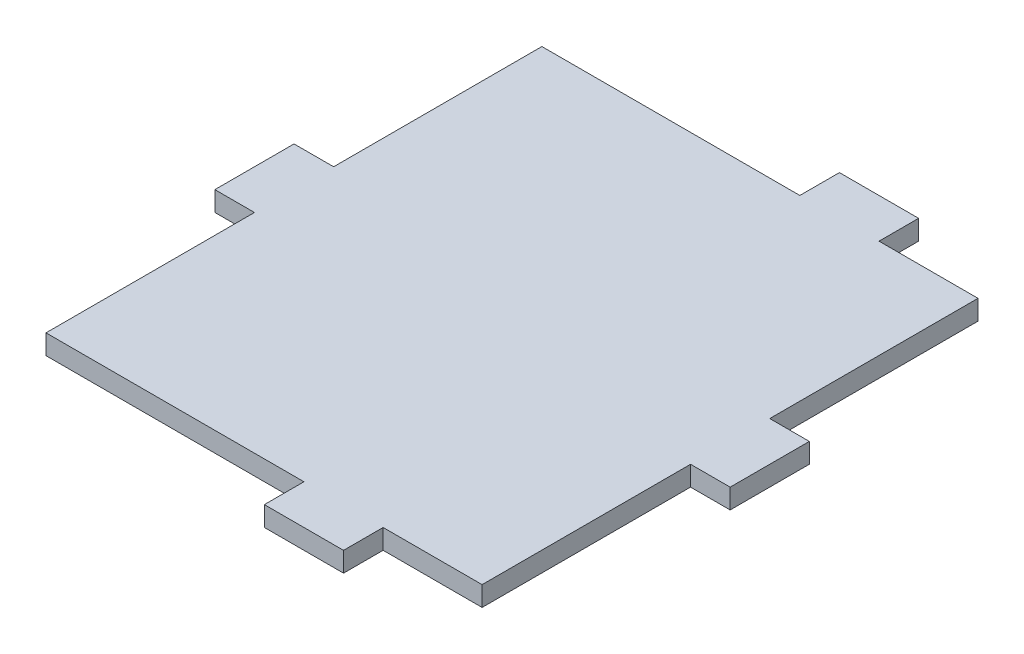
ISO-10303-21;
HEADER;
FILE_DESCRIPTION(('STEP AP214'),'2;1');
FILE_NAME('part.step','',(''),(''),'','','');
FILE_SCHEMA(('AUTOMOTIVE_DESIGN { 1 0 10303 214 1 1 1 1 }'));
ENDSEC;
DATA;
#1=APPLICATION_CONTEXT('core data for automotive mechanical design processes');
#2=APPLICATION_PROTOCOL_DEFINITION('international standard','automotive_design',2000,#1);
#3=PRODUCT_CONTEXT('',#1,'mechanical');
#4=PRODUCT('Part','Part','',(#3));
#5=PRODUCT_RELATED_PRODUCT_CATEGORY('part','',(#4));
#6=PRODUCT_DEFINITION_FORMATION('','',#4);
#7=PRODUCT_DEFINITION_CONTEXT('part definition',#1,'design');
#8=PRODUCT_DEFINITION('design','',#6,#7);
#9=PRODUCT_DEFINITION_SHAPE('','',#8);
#10=(LENGTH_UNIT() NAMED_UNIT(*) SI_UNIT(.MILLI.,.METRE.));
#11=(NAMED_UNIT(*) PLANE_ANGLE_UNIT() SI_UNIT($,.RADIAN.));
#12=(NAMED_UNIT(*) SI_UNIT($,.STERADIAN.) SOLID_ANGLE_UNIT());
#13=UNCERTAINTY_MEASURE_WITH_UNIT(LENGTH_MEASURE(1.E-05),#10,'distance_accuracy_value','');
#14=(GEOMETRIC_REPRESENTATION_CONTEXT(3) GLOBAL_UNCERTAINTY_ASSIGNED_CONTEXT((#13)) GLOBAL_UNIT_ASSIGNED_CONTEXT((#10,
#11,#12)) REPRESENTATION_CONTEXT('',''));
#15=CARTESIAN_POINT('',(0.,0.,0.));
#16=DIRECTION('',(0.,0.,1.));
#17=DIRECTION('',(1.,0.,0.));
#18=AXIS2_PLACEMENT_3D('',#15,#16,#17);
#19=CARTESIAN_POINT('',(15.03,1.,-29.05));
#20=DIRECTION('',(0.,0.,1.));
#21=DIRECTION('',(1.,0.,0.));
#22=AXIS2_PLACEMENT_3D('',#19,#20,#21);
#23=PLANE('',#22);
#24=DIRECTION('',(-1.,0.,0.));
#25=VECTOR('',#24,1.);
#26=CARTESIAN_POINT('',(15.03,0.,-29.05));
#27=LINE('',#26,#25);
#28=CARTESIAN_POINT('',(19.03,0.,-29.05));
#29=VERTEX_POINT('',#28);
#30=CARTESIAN_POINT('',(15.03,0.,-29.05));
#31=VERTEX_POINT('',#30);
#32=EDGE_CURVE('E212',#29,#31,#27,.T.);
#33=ORIENTED_EDGE('',*,*,#32,.T.);
#34=DIRECTION('',(0.,-1.,0.));
#35=VECTOR('',#34,1.);
#36=CARTESIAN_POINT('',(15.03,1.,-29.05));
#37=LINE('',#36,#35);
#38=CARTESIAN_POINT('',(15.03,1.,-29.05));
#39=VERTEX_POINT('',#38);
#40=EDGE_CURVE('E11',#39,#31,#37,.T.);
#41=ORIENTED_EDGE('',*,*,#40,.F.);
#42=DIRECTION('',(-1.,0.,0.));
#43=VECTOR('',#42,1.);
#44=CARTESIAN_POINT('',(15.03,1.,-29.05));
#45=LINE('',#44,#43);
#46=CARTESIAN_POINT('',(19.03,1.,-29.05));
#47=VERTEX_POINT('',#46);
#48=EDGE_CURVE('E270',#47,#39,#45,.T.);
#49=ORIENTED_EDGE('',*,*,#48,.F.);
#50=DIRECTION('',(0.,-1.,0.));
#51=VECTOR('',#50,1.);
#52=CARTESIAN_POINT('',(19.03,1.,-29.05));
#53=LINE('',#52,#51);
#54=EDGE_CURVE('E208',#47,#29,#53,.T.);
#55=ORIENTED_EDGE('',*,*,#54,.T.);
#56=EDGE_LOOP('',(#33,#41,#49,#55));
#57=FACE_BOUND('',#56,.T.);
#58=ADVANCED_FACE('F39',(#57),#23,.F.);
#59=CARTESIAN_POINT('',(15.03,1.,-27.05));
#60=DIRECTION('',(1.,0.,0.));
#61=DIRECTION('',(0.,0.,-1.));
#62=AXIS2_PLACEMENT_3D('',#59,#60,#61);
#63=PLANE('',#62);
#64=DIRECTION('',(0.,0.,1.));
#65=VECTOR('',#64,1.);
#66=CARTESIAN_POINT('',(15.03,0.,-27.05));
#67=LINE('',#66,#65);
#68=CARTESIAN_POINT('',(15.03,0.,-27.05));
#69=VERTEX_POINT('',#68);
#70=EDGE_CURVE('E216',#31,#69,#67,.T.);
#71=ORIENTED_EDGE('',*,*,#70,.T.);
#72=DIRECTION('',(0.,-1.,0.));
#73=VECTOR('',#72,1.);
#74=CARTESIAN_POINT('',(15.03,1.,-27.05));
#75=LINE('',#74,#73);
#76=CARTESIAN_POINT('',(15.03,1.,-27.05));
#77=VERTEX_POINT('',#76);
#78=EDGE_CURVE('E48',#77,#69,#75,.T.);
#79=ORIENTED_EDGE('',*,*,#78,.F.);
#80=DIRECTION('',(0.,0.,1.));
#81=VECTOR('',#80,1.);
#82=CARTESIAN_POINT('',(15.03,1.,-27.05));
#83=LINE('',#82,#81);
#84=EDGE_CURVE('E135',#39,#77,#83,.T.);
#85=ORIENTED_EDGE('',*,*,#84,.F.);
#86=ORIENTED_EDGE('',*,*,#40,.T.);
#87=EDGE_LOOP('',(#71,#79,#85,#86));
#88=FACE_BOUND('',#87,.T.);
#89=ADVANCED_FACE('F420',(#88),#63,.F.);
#90=CARTESIAN_POINT('',(15.03,1.,-27.05));
#91=DIRECTION('',(0.,0.,1.));
#92=DIRECTION('',(1.,0.,0.));
#93=AXIS2_PLACEMENT_3D('',#90,#91,#92);
#94=PLANE('',#93);
#95=DIRECTION('',(-1.,0.,0.));
#96=VECTOR('',#95,1.);
#97=CARTESIAN_POINT('',(15.03,0.,-27.05));
#98=LINE('',#97,#96);
#99=CARTESIAN_POINT('',(2.,0.,-27.05));
#100=VERTEX_POINT('',#99);
#101=EDGE_CURVE('E219',#69,#100,#98,.T.);
#102=ORIENTED_EDGE('',*,*,#101,.T.);
#103=DIRECTION('',(0.,-1.,0.));
#104=VECTOR('',#103,1.);
#105=CARTESIAN_POINT('',(2.,1.,-27.05));
#106=LINE('',#105,#104);
#107=CARTESIAN_POINT('',(2.,1.,-27.05));
#108=VERTEX_POINT('',#107);
#109=EDGE_CURVE('E329',#108,#100,#106,.T.);
#110=ORIENTED_EDGE('',*,*,#109,.F.);
#111=DIRECTION('',(-1.,0.,0.));
#112=VECTOR('',#111,1.);
#113=CARTESIAN_POINT('',(15.03,1.,-27.05));
#114=LINE('',#113,#112);
#115=EDGE_CURVE('E339',#77,#108,#114,.T.);
#116=ORIENTED_EDGE('',*,*,#115,.F.);
#117=ORIENTED_EDGE('',*,*,#78,.T.);
#118=EDGE_LOOP('',(#102,#110,#116,#117));
#119=FACE_BOUND('',#118,.T.);
#120=ADVANCED_FACE('F337',(#119),#94,.F.);
#121=CARTESIAN_POINT('',(2.,1.,-16.53));
#122=DIRECTION('',(1.,0.,0.));
#123=DIRECTION('',(0.,0.,-1.));
#124=AXIS2_PLACEMENT_3D('',#121,#122,#123);
#125=PLANE('',#124);
#126=DIRECTION('',(0.,0.,1.));
#127=VECTOR('',#126,1.);
#128=CARTESIAN_POINT('',(2.,0.,-16.53));
#129=LINE('',#128,#127);
#130=CARTESIAN_POINT('',(2.,0.,-16.53));
#131=VERTEX_POINT('',#130);
#132=EDGE_CURVE('E222',#100,#131,#129,.T.);
#133=ORIENTED_EDGE('',*,*,#132,.T.);
#134=DIRECTION('',(0.,-1.,0.));
#135=VECTOR('',#134,1.);
#136=CARTESIAN_POINT('',(2.,1.,-16.53));
#137=LINE('',#136,#135);
#138=CARTESIAN_POINT('',(2.,1.,-16.53));
#139=VERTEX_POINT('',#138);
#140=EDGE_CURVE('E325',#139,#131,#137,.T.);
#141=ORIENTED_EDGE('',*,*,#140,.F.);
#142=DIRECTION('',(0.,0.,1.));
#143=VECTOR('',#142,1.);
#144=CARTESIAN_POINT('',(2.,1.,-16.53));
#145=LINE('',#144,#143);
#146=EDGE_CURVE('E358',#108,#139,#145,.T.);
#147=ORIENTED_EDGE('',*,*,#146,.F.);
#148=ORIENTED_EDGE('',*,*,#109,.T.);
#149=EDGE_LOOP('',(#133,#141,#147,#148));
#150=FACE_BOUND('',#149,.T.);
#151=ADVANCED_FACE('F348',(#150),#125,.F.);
#152=CARTESIAN_POINT('',(2.,1.,-16.53));
#153=DIRECTION('',(0.,0.,1.));
#154=DIRECTION('',(1.,0.,0.));
#155=AXIS2_PLACEMENT_3D('',#152,#153,#154);
#156=PLANE('',#155);
#157=DIRECTION('',(-1.,0.,0.));
#158=VECTOR('',#157,1.);
#159=CARTESIAN_POINT('',(2.,0.,-16.53));
#160=LINE('',#159,#158);
#161=CARTESIAN_POINT('',(0.,0.,-16.53));
#162=VERTEX_POINT('',#161);
#163=EDGE_CURVE('E225',#131,#162,#160,.T.);
#164=ORIENTED_EDGE('',*,*,#163,.T.);
#165=DIRECTION('',(0.,-1.,0.));
#166=VECTOR('',#165,1.);
#167=CARTESIAN_POINT('',(0.,1.,-16.53));
#168=LINE('',#167,#166);
#169=CARTESIAN_POINT('',(0.,1.,-16.53));
#170=VERTEX_POINT('',#169);
#171=EDGE_CURVE('E321',#170,#162,#168,.T.);
#172=ORIENTED_EDGE('',*,*,#171,.F.);
#173=DIRECTION('',(-1.,0.,0.));
#174=VECTOR('',#173,1.);
#175=CARTESIAN_POINT('',(2.,1.,-16.53));
#176=LINE('',#175,#174);
#177=EDGE_CURVE('E354',#139,#170,#176,.T.);
#178=ORIENTED_EDGE('',*,*,#177,.F.);
#179=ORIENTED_EDGE('',*,*,#140,.T.);
#180=EDGE_LOOP('',(#164,#172,#178,#179));
#181=FACE_BOUND('',#180,.T.);
#182=ADVANCED_FACE('F352',(#181),#156,.F.);
#183=CARTESIAN_POINT('',(0.,1.,-16.53));
#184=DIRECTION('',(1.,0.,0.));
#185=DIRECTION('',(0.,0.,-1.));
#186=AXIS2_PLACEMENT_3D('',#183,#184,#185);
#187=PLANE('',#186);
#188=DIRECTION('',(0.,0.,1.));
#189=VECTOR('',#188,1.);
#190=CARTESIAN_POINT('',(0.,0.,-16.53));
#191=LINE('',#190,#189);
#192=CARTESIAN_POINT('',(0.,0.,-12.53));
#193=VERTEX_POINT('',#192);
#194=EDGE_CURVE('E228',#162,#193,#191,.T.);
#195=ORIENTED_EDGE('',*,*,#194,.T.);
#196=DIRECTION('',(0.,-1.,0.));
#197=VECTOR('',#196,1.);
#198=CARTESIAN_POINT('',(0.,1.,-12.53));
#199=LINE('',#198,#197);
#200=CARTESIAN_POINT('',(0.,1.,-12.53));
#201=VERTEX_POINT('',#200);
#202=EDGE_CURVE('E317',#201,#193,#199,.T.);
#203=ORIENTED_EDGE('',*,*,#202,.F.);
#204=DIRECTION('',(0.,0.,1.));
#205=VECTOR('',#204,1.);
#206=CARTESIAN_POINT('',(0.,1.,-16.53));
#207=LINE('',#206,#205);
#208=EDGE_CURVE('E357',#170,#201,#207,.T.);
#209=ORIENTED_EDGE('',*,*,#208,.F.);
#210=ORIENTED_EDGE('',*,*,#171,.T.);
#211=EDGE_LOOP('',(#195,#203,#209,#210));
#212=FACE_BOUND('',#211,.T.);
#213=ADVANCED_FACE('F433',(#212),#187,.F.);
#214=CARTESIAN_POINT('',(0.,1.,-12.53));
#215=DIRECTION('',(0.,0.,-1.));
#216=DIRECTION('',(-1.,0.,0.));
#217=AXIS2_PLACEMENT_3D('',#214,#215,#216);
#218=PLANE('',#217);
#219=DIRECTION('',(1.,0.,0.));
#220=VECTOR('',#219,1.);
#221=CARTESIAN_POINT('',(0.,0.,-12.53));
#222=LINE('',#221,#220);
#223=CARTESIAN_POINT('',(2.,0.,-12.53));
#224=VERTEX_POINT('',#223);
#225=EDGE_CURVE('E231',#193,#224,#222,.T.);
#226=ORIENTED_EDGE('',*,*,#225,.T.);
#227=DIRECTION('',(0.,-1.,0.));
#228=VECTOR('',#227,1.);
#229=CARTESIAN_POINT('',(2.,1.,-12.53));
#230=LINE('',#229,#228);
#231=CARTESIAN_POINT('',(2.,1.,-12.53));
#232=VERTEX_POINT('',#231);
#233=EDGE_CURVE('E313',#232,#224,#230,.T.);
#234=ORIENTED_EDGE('',*,*,#233,.F.);
#235=DIRECTION('',(1.,0.,0.));
#236=VECTOR('',#235,1.);
#237=CARTESIAN_POINT('',(0.,1.,-12.53));
#238=LINE('',#237,#236);
#239=EDGE_CURVE('E362',#201,#232,#238,.T.);
#240=ORIENTED_EDGE('',*,*,#239,.F.);
#241=ORIENTED_EDGE('',*,*,#202,.T.);
#242=EDGE_LOOP('',(#226,#234,#240,#241));
#243=FACE_BOUND('',#242,.T.);
#244=ADVANCED_FACE('F436',(#243),#218,.F.);
#245=CARTESIAN_POINT('',(2.,1.,-2.));
#246=DIRECTION('',(1.,0.,0.));
#247=DIRECTION('',(0.,0.,-1.));
#248=AXIS2_PLACEMENT_3D('',#245,#246,#247);
#249=PLANE('',#248);
#250=DIRECTION('',(0.,0.,1.));
#251=VECTOR('',#250,1.);
#252=CARTESIAN_POINT('',(2.,0.,-2.));
#253=LINE('',#252,#251);
#254=CARTESIAN_POINT('',(2.,0.,-2.));
#255=VERTEX_POINT('',#254);
#256=EDGE_CURVE('E234',#224,#255,#253,.T.);
#257=ORIENTED_EDGE('',*,*,#256,.T.);
#258=DIRECTION('',(0.,-1.,0.));
#259=VECTOR('',#258,1.);
#260=CARTESIAN_POINT('',(2.,1.,-2.));
#261=LINE('',#260,#259);
#262=CARTESIAN_POINT('',(2.,1.,-2.));
#263=VERTEX_POINT('',#262);
#264=EDGE_CURVE('E309',#263,#255,#261,.T.);
#265=ORIENTED_EDGE('',*,*,#264,.F.);
#266=DIRECTION('',(0.,0.,1.));
#267=VECTOR('',#266,1.);
#268=CARTESIAN_POINT('',(2.,1.,-2.));
#269=LINE('',#268,#267);
#270=EDGE_CURVE('E369',#232,#263,#269,.T.);
#271=ORIENTED_EDGE('',*,*,#270,.F.);
#272=ORIENTED_EDGE('',*,*,#233,.T.);
#273=EDGE_LOOP('',(#257,#265,#271,#272));
#274=FACE_BOUND('',#273,.T.);
#275=ADVANCED_FACE('F440',(#274),#249,.F.);
#276=CARTESIAN_POINT('',(15.03,1.,-2.));
#277=DIRECTION('',(0.,0.,-1.));
#278=DIRECTION('',(-1.,0.,0.));
#279=AXIS2_PLACEMENT_3D('',#276,#277,#278);
#280=PLANE('',#279);
#281=DIRECTION('',(1.,0.,0.));
#282=VECTOR('',#281,1.);
#283=CARTESIAN_POINT('',(15.03,0.,-2.));
#284=LINE('',#283,#282);
#285=CARTESIAN_POINT('',(15.03,0.,-2.));
#286=VERTEX_POINT('',#285);
#287=EDGE_CURVE('E237',#255,#286,#284,.T.);
#288=ORIENTED_EDGE('',*,*,#287,.T.);
#289=DIRECTION('',(0.,-1.,0.));
#290=VECTOR('',#289,1.);
#291=CARTESIAN_POINT('',(15.03,1.,-2.));
#292=LINE('',#291,#290);
#293=CARTESIAN_POINT('',(15.03,1.,-2.));
#294=VERTEX_POINT('',#293);
#295=EDGE_CURVE('E305',#294,#286,#292,.T.);
#296=ORIENTED_EDGE('',*,*,#295,.F.);
#297=DIRECTION('',(1.,0.,0.));
#298=VECTOR('',#297,1.);
#299=CARTESIAN_POINT('',(15.03,1.,-2.));
#300=LINE('',#299,#298);
#301=EDGE_CURVE('E372',#263,#294,#300,.T.);
#302=ORIENTED_EDGE('',*,*,#301,.F.);
#303=ORIENTED_EDGE('',*,*,#264,.T.);
#304=EDGE_LOOP('',(#288,#296,#302,#303));
#305=FACE_BOUND('',#304,.T.);
#306=ADVANCED_FACE('F444',(#305),#280,.F.);
#307=CARTESIAN_POINT('',(15.03,1.,-2.));
#308=DIRECTION('',(1.,0.,0.));
#309=DIRECTION('',(0.,0.,-1.));
#310=AXIS2_PLACEMENT_3D('',#307,#308,#309);
#311=PLANE('',#310);
#312=DIRECTION('',(0.,0.,1.));
#313=VECTOR('',#312,1.);
#314=CARTESIAN_POINT('',(15.03,0.,-2.));
#315=LINE('',#314,#313);
#316=CARTESIAN_POINT('',(15.03,0.,0.));
#317=VERTEX_POINT('',#316);
#318=EDGE_CURVE('E240',#286,#317,#315,.T.);
#319=ORIENTED_EDGE('',*,*,#318,.T.);
#320=DIRECTION('',(0.,-1.,0.));
#321=VECTOR('',#320,1.);
#322=CARTESIAN_POINT('',(15.03,1.,0.));
#323=LINE('',#322,#321);
#324=CARTESIAN_POINT('',(15.03,1.,0.));
#325=VERTEX_POINT('',#324);
#326=EDGE_CURVE('E301',#325,#317,#323,.T.);
#327=ORIENTED_EDGE('',*,*,#326,.F.);
#328=DIRECTION('',(0.,0.,1.));
#329=VECTOR('',#328,1.);
#330=CARTESIAN_POINT('',(15.03,1.,-2.));
#331=LINE('',#330,#329);
#332=EDGE_CURVE('E375',#294,#325,#331,.T.);
#333=ORIENTED_EDGE('',*,*,#332,.F.);
#334=ORIENTED_EDGE('',*,*,#295,.T.);
#335=EDGE_LOOP('',(#319,#327,#333,#334));
#336=FACE_BOUND('',#335,.T.);
#337=ADVANCED_FACE('F448',(#336),#311,.F.);
#338=CARTESIAN_POINT('',(15.03,1.,0.));
#339=DIRECTION('',(0.,0.,-1.));
#340=DIRECTION('',(-1.,0.,0.));
#341=AXIS2_PLACEMENT_3D('',#338,#339,#340);
#342=PLANE('',#341);
#343=DIRECTION('',(1.,0.,0.));
#344=VECTOR('',#343,1.);
#345=CARTESIAN_POINT('',(15.03,0.,0.));
#346=LINE('',#345,#344);
#347=CARTESIAN_POINT('',(19.03,0.,0.));
#348=VERTEX_POINT('',#347);
#349=EDGE_CURVE('E243',#317,#348,#346,.T.);
#350=ORIENTED_EDGE('',*,*,#349,.T.);
#351=DIRECTION('',(0.,-1.,0.));
#352=VECTOR('',#351,1.);
#353=CARTESIAN_POINT('',(19.03,1.,0.));
#354=LINE('',#353,#352);
#355=CARTESIAN_POINT('',(19.03,1.,0.));
#356=VERTEX_POINT('',#355);
#357=EDGE_CURVE('E297',#356,#348,#354,.T.);
#358=ORIENTED_EDGE('',*,*,#357,.F.);
#359=DIRECTION('',(1.,0.,0.));
#360=VECTOR('',#359,1.);
#361=CARTESIAN_POINT('',(15.03,1.,0.));
#362=LINE('',#361,#360);
#363=EDGE_CURVE('E378',#325,#356,#362,.T.);
#364=ORIENTED_EDGE('',*,*,#363,.F.);
#365=ORIENTED_EDGE('',*,*,#326,.T.);
#366=EDGE_LOOP('',(#350,#358,#364,#365));
#367=FACE_BOUND('',#366,.T.);
#368=ADVANCED_FACE('F452',(#367),#342,.F.);
#369=CARTESIAN_POINT('',(19.03,1.,0.));
#370=DIRECTION('',(-1.,0.,0.));
#371=DIRECTION('',(0.,0.,1.));
#372=AXIS2_PLACEMENT_3D('',#369,#370,#371);
#373=PLANE('',#372);
#374=DIRECTION('',(0.,0.,-1.));
#375=VECTOR('',#374,1.);
#376=CARTESIAN_POINT('',(19.03,0.,0.));
#377=LINE('',#376,#375);
#378=CARTESIAN_POINT('',(19.03,0.,-2.));
#379=VERTEX_POINT('',#378);
#380=EDGE_CURVE('E246',#348,#379,#377,.T.);
#381=ORIENTED_EDGE('',*,*,#380,.T.);
#382=DIRECTION('',(0.,-1.,0.));
#383=VECTOR('',#382,1.);
#384=CARTESIAN_POINT('',(19.03,1.,-2.));
#385=LINE('',#384,#383);
#386=CARTESIAN_POINT('',(19.03,1.,-2.));
#387=VERTEX_POINT('',#386);
#388=EDGE_CURVE('E293',#387,#379,#385,.T.);
#389=ORIENTED_EDGE('',*,*,#388,.F.);
#390=DIRECTION('',(0.,0.,-1.));
#391=VECTOR('',#390,1.);
#392=CARTESIAN_POINT('',(19.03,1.,0.));
#393=LINE('',#392,#391);
#394=EDGE_CURVE('E381',#356,#387,#393,.T.);
#395=ORIENTED_EDGE('',*,*,#394,.F.);
#396=ORIENTED_EDGE('',*,*,#357,.T.);
#397=EDGE_LOOP('',(#381,#389,#395,#396));
#398=FACE_BOUND('',#397,.T.);
#399=ADVANCED_FACE('F456',(#398),#373,.F.);
#400=CARTESIAN_POINT('',(19.03,1.,-2.));
#401=DIRECTION('',(0.,0.,-1.));
#402=DIRECTION('',(-1.,0.,0.));
#403=AXIS2_PLACEMENT_3D('',#400,#401,#402);
#404=PLANE('',#403);
#405=DIRECTION('',(1.,0.,0.));
#406=VECTOR('',#405,1.);
#407=CARTESIAN_POINT('',(19.03,0.,-2.));
#408=LINE('',#407,#406);
#409=CARTESIAN_POINT('',(24.03,0.,-2.));
#410=VERTEX_POINT('',#409);
#411=EDGE_CURVE('E249',#379,#410,#408,.T.);
#412=ORIENTED_EDGE('',*,*,#411,.T.);
#413=DIRECTION('',(0.,-1.,0.));
#414=VECTOR('',#413,1.);
#415=CARTESIAN_POINT('',(24.03,1.,-2.));
#416=LINE('',#415,#414);
#417=CARTESIAN_POINT('',(24.03,1.,-2.));
#418=VERTEX_POINT('',#417);
#419=EDGE_CURVE('E289',#418,#410,#416,.T.);
#420=ORIENTED_EDGE('',*,*,#419,.F.);
#421=DIRECTION('',(1.,0.,0.));
#422=VECTOR('',#421,1.);
#423=CARTESIAN_POINT('',(19.03,1.,-2.));
#424=LINE('',#423,#422);
#425=EDGE_CURVE('E384',#387,#418,#424,.T.);
#426=ORIENTED_EDGE('',*,*,#425,.F.);
#427=ORIENTED_EDGE('',*,*,#388,.T.);
#428=EDGE_LOOP('',(#412,#420,#426,#427));
#429=FACE_BOUND('',#428,.T.);
#430=ADVANCED_FACE('F460',(#429),#404,.F.);
#431=CARTESIAN_POINT('',(24.03,1.,-2.));
#432=DIRECTION('',(-1.,0.,0.));
#433=DIRECTION('',(0.,0.,1.));
#434=AXIS2_PLACEMENT_3D('',#431,#432,#433);
#435=PLANE('',#434);
#436=DIRECTION('',(0.,0.,-1.));
#437=VECTOR('',#436,1.);
#438=CARTESIAN_POINT('',(24.03,0.,-2.));
#439=LINE('',#438,#437);
#440=CARTESIAN_POINT('',(24.03,0.,-12.53));
#441=VERTEX_POINT('',#440);
#442=EDGE_CURVE('E252',#410,#441,#439,.T.);
#443=ORIENTED_EDGE('',*,*,#442,.T.);
#444=DIRECTION('',(0.,-1.,0.));
#445=VECTOR('',#444,1.);
#446=CARTESIAN_POINT('',(24.03,1.,-12.53));
#447=LINE('',#446,#445);
#448=CARTESIAN_POINT('',(24.03,1.,-12.53));
#449=VERTEX_POINT('',#448);
#450=EDGE_CURVE('E285',#449,#441,#447,.T.);
#451=ORIENTED_EDGE('',*,*,#450,.F.);
#452=DIRECTION('',(0.,0.,-1.));
#453=VECTOR('',#452,1.);
#454=CARTESIAN_POINT('',(24.03,1.,-2.));
#455=LINE('',#454,#453);
#456=EDGE_CURVE('E387',#418,#449,#455,.T.);
#457=ORIENTED_EDGE('',*,*,#456,.F.);
#458=ORIENTED_EDGE('',*,*,#419,.T.);
#459=EDGE_LOOP('',(#443,#451,#457,#458));
#460=FACE_BOUND('',#459,.T.);
#461=ADVANCED_FACE('F464',(#460),#435,.F.);
#462=CARTESIAN_POINT('',(26.03,1.,-12.53));
#463=DIRECTION('',(0.,0.,-1.));
#464=DIRECTION('',(-1.,0.,0.));
#465=AXIS2_PLACEMENT_3D('',#462,#463,#464);
#466=PLANE('',#465);
#467=DIRECTION('',(1.,0.,0.));
#468=VECTOR('',#467,1.);
#469=CARTESIAN_POINT('',(26.03,0.,-12.53));
#470=LINE('',#469,#468);
#471=CARTESIAN_POINT('',(26.03,0.,-12.53));
#472=VERTEX_POINT('',#471);
#473=EDGE_CURVE('E255',#441,#472,#470,.T.);
#474=ORIENTED_EDGE('',*,*,#473,.T.);
#475=DIRECTION('',(0.,-1.,0.));
#476=VECTOR('',#475,1.);
#477=CARTESIAN_POINT('',(26.03,1.,-12.53));
#478=LINE('',#477,#476);
#479=CARTESIAN_POINT('',(26.03,1.,-12.53));
#480=VERTEX_POINT('',#479);
#481=EDGE_CURVE('E281',#480,#472,#478,.T.);
#482=ORIENTED_EDGE('',*,*,#481,.F.);
#483=DIRECTION('',(1.,0.,0.));
#484=VECTOR('',#483,1.);
#485=CARTESIAN_POINT('',(26.03,1.,-12.53));
#486=LINE('',#485,#484);
#487=EDGE_CURVE('E390',#449,#480,#486,.T.);
#488=ORIENTED_EDGE('',*,*,#487,.F.);
#489=ORIENTED_EDGE('',*,*,#450,.T.);
#490=EDGE_LOOP('',(#474,#482,#488,#489));
#491=FACE_BOUND('',#490,.T.);
#492=ADVANCED_FACE('F468',(#491),#466,.F.);
#493=CARTESIAN_POINT('',(26.03,1.,-16.53));
#494=DIRECTION('',(-1.,0.,0.));
#495=DIRECTION('',(0.,0.,1.));
#496=AXIS2_PLACEMENT_3D('',#493,#494,#495);
#497=PLANE('',#496);
#498=DIRECTION('',(0.,0.,-1.));
#499=VECTOR('',#498,1.);
#500=CARTESIAN_POINT('',(26.03,0.,-16.53));
#501=LINE('',#500,#499);
#502=CARTESIAN_POINT('',(26.03,0.,-16.53));
#503=VERTEX_POINT('',#502);
#504=EDGE_CURVE('E258',#472,#503,#501,.T.);
#505=ORIENTED_EDGE('',*,*,#504,.T.);
#506=DIRECTION('',(0.,-1.,0.));
#507=VECTOR('',#506,1.);
#508=CARTESIAN_POINT('',(26.03,1.,-16.53));
#509=LINE('',#508,#507);
#510=CARTESIAN_POINT('',(26.03,1.,-16.53));
#511=VERTEX_POINT('',#510);
#512=EDGE_CURVE('E277',#511,#503,#509,.T.);
#513=ORIENTED_EDGE('',*,*,#512,.F.);
#514=DIRECTION('',(0.,0.,-1.));
#515=VECTOR('',#514,1.);
#516=CARTESIAN_POINT('',(26.03,1.,-16.53));
#517=LINE('',#516,#515);
#518=EDGE_CURVE('E393',#480,#511,#517,.T.);
#519=ORIENTED_EDGE('',*,*,#518,.F.);
#520=ORIENTED_EDGE('',*,*,#481,.T.);
#521=EDGE_LOOP('',(#505,#513,#519,#520));
#522=FACE_BOUND('',#521,.T.);
#523=ADVANCED_FACE('F401',(#522),#497,.F.);
#524=CARTESIAN_POINT('',(24.03,1.,-16.53));
#525=DIRECTION('',(0.,0.,1.));
#526=DIRECTION('',(1.,0.,0.));
#527=AXIS2_PLACEMENT_3D('',#524,#525,#526);
#528=PLANE('',#527);
#529=DIRECTION('',(-1.,0.,0.));
#530=VECTOR('',#529,1.);
#531=CARTESIAN_POINT('',(24.03,0.,-16.53));
#532=LINE('',#531,#530);
#533=CARTESIAN_POINT('',(24.03,0.,-16.53));
#534=VERTEX_POINT('',#533);
#535=EDGE_CURVE('E261',#503,#534,#532,.T.);
#536=ORIENTED_EDGE('',*,*,#535,.T.);
#537=DIRECTION('',(0.,-1.,0.));
#538=VECTOR('',#537,1.);
#539=CARTESIAN_POINT('',(24.03,1.,-16.53));
#540=LINE('',#539,#538);
#541=CARTESIAN_POINT('',(24.03,1.,-16.53));
#542=VERTEX_POINT('',#541);
#543=EDGE_CURVE('E201',#542,#534,#540,.T.);
#544=ORIENTED_EDGE('',*,*,#543,.F.);
#545=DIRECTION('',(-1.,0.,0.));
#546=VECTOR('',#545,1.);
#547=CARTESIAN_POINT('',(24.03,1.,-16.53));
#548=LINE('',#547,#546);
#549=EDGE_CURVE('E190',#511,#542,#548,.T.);
#550=ORIENTED_EDGE('',*,*,#549,.F.);
#551=ORIENTED_EDGE('',*,*,#512,.T.);
#552=EDGE_LOOP('',(#536,#544,#550,#551));
#553=FACE_BOUND('',#552,.T.);
#554=ADVANCED_FACE('F405',(#553),#528,.F.);
#555=CARTESIAN_POINT('',(24.03,1.,-16.53));
#556=DIRECTION('',(-1.,0.,0.));
#557=DIRECTION('',(0.,0.,1.));
#558=AXIS2_PLACEMENT_3D('',#555,#556,#557);
#559=PLANE('',#558);
#560=DIRECTION('',(0.,0.,-1.));
#561=VECTOR('',#560,1.);
#562=CARTESIAN_POINT('',(24.03,0.,-16.53));
#563=LINE('',#562,#561);
#564=CARTESIAN_POINT('',(24.03,0.,-27.05));
#565=VERTEX_POINT('',#564);
#566=EDGE_CURVE('E199',#534,#565,#563,.T.);
#567=ORIENTED_EDGE('',*,*,#566,.T.);
#568=DIRECTION('',(0.,-1.,0.));
#569=VECTOR('',#568,1.);
#570=CARTESIAN_POINT('',(24.03,1.,-27.05));
#571=LINE('',#570,#569);
#572=CARTESIAN_POINT('',(24.03,1.,-27.05));
#573=VERTEX_POINT('',#572);
#574=EDGE_CURVE('E196',#573,#565,#571,.T.);
#575=ORIENTED_EDGE('',*,*,#574,.F.);
#576=DIRECTION('',(0.,0.,-1.));
#577=VECTOR('',#576,1.);
#578=CARTESIAN_POINT('',(24.03,1.,-16.53));
#579=LINE('',#578,#577);
#580=EDGE_CURVE('E184',#542,#573,#579,.T.);
#581=ORIENTED_EDGE('',*,*,#580,.F.);
#582=ORIENTED_EDGE('',*,*,#543,.T.);
#583=EDGE_LOOP('',(#567,#575,#581,#582));
#584=FACE_BOUND('',#583,.T.);
#585=ADVANCED_FACE('F197',(#584),#559,.F.);
#586=CARTESIAN_POINT('',(19.03,1.,-27.05));
#587=DIRECTION('',(0.,0.,1.));
#588=DIRECTION('',(1.,0.,0.));
#589=AXIS2_PLACEMENT_3D('',#586,#587,#588);
#590=PLANE('',#589);
#591=DIRECTION('',(-1.,0.,0.));
#592=VECTOR('',#591,1.);
#593=CARTESIAN_POINT('',(19.03,0.,-27.05));
#594=LINE('',#593,#592);
#595=CARTESIAN_POINT('',(19.03,0.,-27.05));
#596=VERTEX_POINT('',#595);
#597=EDGE_CURVE('E121',#565,#596,#594,.T.);
#598=ORIENTED_EDGE('',*,*,#597,.T.);
#599=DIRECTION('',(0.,-1.,0.));
#600=VECTOR('',#599,1.);
#601=CARTESIAN_POINT('',(19.03,1.,-27.05));
#602=LINE('',#601,#600);
#603=CARTESIAN_POINT('',(19.03,1.,-27.05));
#604=VERTEX_POINT('',#603);
#605=EDGE_CURVE('E202',#604,#596,#602,.T.);
#606=ORIENTED_EDGE('',*,*,#605,.F.);
#607=DIRECTION('',(-1.,0.,0.));
#608=VECTOR('',#607,1.);
#609=CARTESIAN_POINT('',(19.03,1.,-27.05));
#610=LINE('',#609,#608);
#611=EDGE_CURVE('E188',#573,#604,#610,.T.);
#612=ORIENTED_EDGE('',*,*,#611,.F.);
#613=ORIENTED_EDGE('',*,*,#574,.T.);
#614=EDGE_LOOP('',(#598,#606,#612,#613));
#615=FACE_BOUND('',#614,.T.);
#616=ADVANCED_FACE('F204',(#615),#590,.F.);
#617=CARTESIAN_POINT('',(19.03,1.,-29.05));
#618=DIRECTION('',(-1.,0.,0.));
#619=DIRECTION('',(0.,0.,1.));
#620=AXIS2_PLACEMENT_3D('',#617,#618,#619);
#621=PLANE('',#620);
#622=DIRECTION('',(0.,0.,-1.));
#623=VECTOR('',#622,1.);
#624=CARTESIAN_POINT('',(19.03,0.,-29.05));
#625=LINE('',#624,#623);
#626=EDGE_CURVE('E127',#596,#29,#625,.T.);
#627=ORIENTED_EDGE('',*,*,#626,.T.);
#628=ORIENTED_EDGE('',*,*,#54,.F.);
#629=DIRECTION('',(0.,0.,-1.));
#630=VECTOR('',#629,1.);
#631=CARTESIAN_POINT('',(19.03,1.,-29.05));
#632=LINE('',#631,#630);
#633=EDGE_CURVE('E56',#604,#47,#632,.T.);
#634=ORIENTED_EDGE('',*,*,#633,.F.);
#635=ORIENTED_EDGE('',*,*,#605,.T.);
#636=EDGE_LOOP('',(#627,#628,#634,#635));
#637=FACE_BOUND('',#636,.T.);
#638=ADVANCED_FACE('F409',(#637),#621,.F.);
#639=CARTESIAN_POINT('',(0.,1.,0.));
#640=DIRECTION('',(0.,-1.,0.));
#641=DIRECTION('',(0.,0.,-1.));
#642=AXIS2_PLACEMENT_3D('',#639,#640,#641);
#643=PLANE('',#642);
#644=ORIENTED_EDGE('',*,*,#48,.T.);
#645=ORIENTED_EDGE('',*,*,#84,.T.);
#646=ORIENTED_EDGE('',*,*,#115,.T.);
#647=ORIENTED_EDGE('',*,*,#146,.T.);
#648=ORIENTED_EDGE('',*,*,#177,.T.);
#649=ORIENTED_EDGE('',*,*,#208,.T.);
#650=ORIENTED_EDGE('',*,*,#239,.T.);
#651=ORIENTED_EDGE('',*,*,#270,.T.);
#652=ORIENTED_EDGE('',*,*,#301,.T.);
#653=ORIENTED_EDGE('',*,*,#332,.T.);
#654=ORIENTED_EDGE('',*,*,#363,.T.);
#655=ORIENTED_EDGE('',*,*,#394,.T.);
#656=ORIENTED_EDGE('',*,*,#425,.T.);
#657=ORIENTED_EDGE('',*,*,#456,.T.);
#658=ORIENTED_EDGE('',*,*,#487,.T.);
#659=ORIENTED_EDGE('',*,*,#518,.T.);
#660=ORIENTED_EDGE('',*,*,#549,.T.);
#661=ORIENTED_EDGE('',*,*,#580,.T.);
#662=ORIENTED_EDGE('',*,*,#611,.T.);
#663=ORIENTED_EDGE('',*,*,#633,.T.);
#664=EDGE_LOOP('',(#644,#645,#646,#647,#648,#649,#650,#651,#652,#653,#654,#655,#656,#657,#658,
#659,#660,#661,#662,#663));
#665=FACE_BOUND('',#664,.T.);
#666=ADVANCED_FACE('F186',(#665),#643,.F.);
#667=CARTESIAN_POINT('',(0.,0.,0.));
#668=DIRECTION('',(0.,-1.,0.));
#669=DIRECTION('',(0.,0.,-1.));
#670=AXIS2_PLACEMENT_3D('',#667,#668,#669);
#671=PLANE('',#670);
#672=ORIENTED_EDGE('',*,*,#32,.F.);
#673=ORIENTED_EDGE('',*,*,#626,.F.);
#674=ORIENTED_EDGE('',*,*,#597,.F.);
#675=ORIENTED_EDGE('',*,*,#566,.F.);
#676=ORIENTED_EDGE('',*,*,#535,.F.);
#677=ORIENTED_EDGE('',*,*,#504,.F.);
#678=ORIENTED_EDGE('',*,*,#473,.F.);
#679=ORIENTED_EDGE('',*,*,#442,.F.);
#680=ORIENTED_EDGE('',*,*,#411,.F.);
#681=ORIENTED_EDGE('',*,*,#380,.F.);
#682=ORIENTED_EDGE('',*,*,#349,.F.);
#683=ORIENTED_EDGE('',*,*,#318,.F.);
#684=ORIENTED_EDGE('',*,*,#287,.F.);
#685=ORIENTED_EDGE('',*,*,#256,.F.);
#686=ORIENTED_EDGE('',*,*,#225,.F.);
#687=ORIENTED_EDGE('',*,*,#194,.F.);
#688=ORIENTED_EDGE('',*,*,#163,.F.);
#689=ORIENTED_EDGE('',*,*,#132,.F.);
#690=ORIENTED_EDGE('',*,*,#101,.F.);
#691=ORIENTED_EDGE('',*,*,#70,.F.);
#692=EDGE_LOOP('',(#672,#673,#674,#675,#676,#677,#678,#679,#680,#681,#682,#683,#684,#685,#686,
#687,#688,#689,#690,#691));
#693=FACE_BOUND('',#692,.T.);
#694=ADVANCED_FACE('F343',(#693),#671,.T.);
#695=CLOSED_SHELL('',(#58,#89,#120,#151,#182,#213,#244,#275,#306,#337,#368,#399,#430,#461,#492,
#523,#554,#585,#616,#638,#666,#694));
#696=MANIFOLD_SOLID_BREP('B2',#695);
#697=ADVANCED_BREP_SHAPE_REPRESENTATION('',(#18,#696),#14);
#698=SHAPE_DEFINITION_REPRESENTATION(#9,#697);
ENDSEC;
END-ISO-10303-21;
